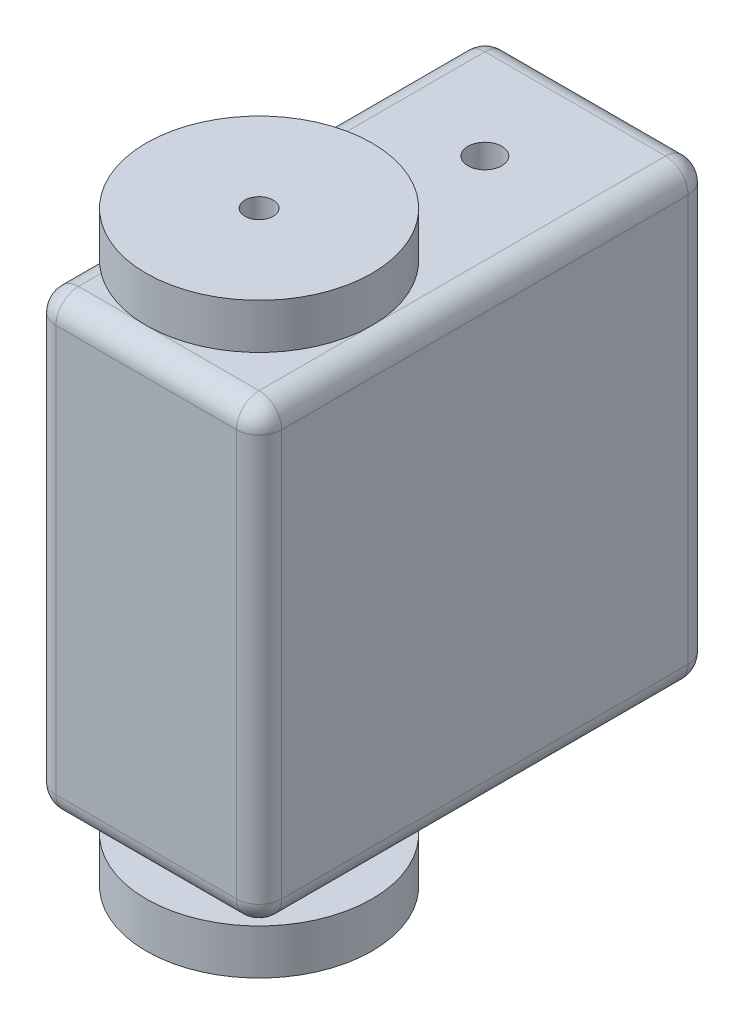
ISO-10303-21;
HEADER;
FILE_DESCRIPTION(('STEP AP214'),'2;1');
FILE_NAME('part.step','',(''),(''),'','','');
FILE_SCHEMA(('AUTOMOTIVE_DESIGN { 1 0 10303 214 1 1 1 1 }'));
ENDSEC;
DATA;
#1=APPLICATION_CONTEXT('core data for automotive mechanical design processes');
#2=APPLICATION_PROTOCOL_DEFINITION('international standard','automotive_design',2000,#1);
#3=PRODUCT_CONTEXT('',#1,'mechanical');
#4=PRODUCT('Part','Part','',(#3));
#5=PRODUCT_RELATED_PRODUCT_CATEGORY('part','',(#4));
#6=PRODUCT_DEFINITION_FORMATION('','',#4);
#7=PRODUCT_DEFINITION_CONTEXT('part definition',#1,'design');
#8=PRODUCT_DEFINITION('design','',#6,#7);
#9=PRODUCT_DEFINITION_SHAPE('','',#8);
#10=(LENGTH_UNIT() NAMED_UNIT(*) SI_UNIT(.MILLI.,.METRE.));
#11=(NAMED_UNIT(*) PLANE_ANGLE_UNIT() SI_UNIT($,.RADIAN.));
#12=(NAMED_UNIT(*) SI_UNIT($,.STERADIAN.) SOLID_ANGLE_UNIT());
#13=UNCERTAINTY_MEASURE_WITH_UNIT(LENGTH_MEASURE(1.E-05),#10,'distance_accuracy_value','');
#14=(GEOMETRIC_REPRESENTATION_CONTEXT(3) GLOBAL_UNCERTAINTY_ASSIGNED_CONTEXT((#13)) GLOBAL_UNIT_ASSIGNED_CONTEXT((#10,
#11,#12)) REPRESENTATION_CONTEXT('',''));
#15=CARTESIAN_POINT('',(0.,0.,0.));
#16=DIRECTION('',(0.,0.,1.));
#17=DIRECTION('',(1.,0.,0.));
#18=AXIS2_PLACEMENT_3D('',#15,#16,#17);
#19=CARTESIAN_POINT('',(10.,-20.,20.));
#20=DIRECTION('',(0.,0.,-1.));
#21=DIRECTION('',(-1.,0.,0.));
#22=AXIS2_PLACEMENT_3D('',#19,#20,#21);
#23=PLANE('',#22);
#24=DIRECTION('',(-1.,0.,0.));
#25=VECTOR('',#24,1.);
#26=CARTESIAN_POINT('',(10.,18.,20.));
#27=LINE('',#26,#25);
#28=CARTESIAN_POINT('',(8.,18.,20.));
#29=VERTEX_POINT('',#28);
#30=CARTESIAN_POINT('',(-8.,18.,20.));
#31=VERTEX_POINT('',#30);
#32=EDGE_CURVE('E138',#29,#31,#27,.T.);
#33=ORIENTED_EDGE('',*,*,#32,.T.);
#34=DIRECTION('',(0.,-1.,0.));
#35=VECTOR('',#34,1.);
#36=CARTESIAN_POINT('',(-8.,-20.,20.));
#37=LINE('',#36,#35);
#38=CARTESIAN_POINT('',(-8.,-18.,20.));
#39=VERTEX_POINT('',#38);
#40=EDGE_CURVE('E133',#31,#39,#37,.T.);
#41=ORIENTED_EDGE('',*,*,#40,.T.);
#42=DIRECTION('',(-1.,0.,0.));
#43=VECTOR('',#42,1.);
#44=CARTESIAN_POINT('',(10.,-18.,20.));
#45=LINE('',#44,#43);
#46=CARTESIAN_POINT('',(8.,-18.,20.));
#47=VERTEX_POINT('',#46);
#48=EDGE_CURVE('E126',#39,#47,#45,.F.);
#49=ORIENTED_EDGE('',*,*,#48,.T.);
#50=DIRECTION('',(0.,-1.,0.));
#51=VECTOR('',#50,1.);
#52=CARTESIAN_POINT('',(8.,20.,20.));
#53=LINE('',#52,#51);
#54=EDGE_CURVE('E130',#47,#29,#53,.F.);
#55=ORIENTED_EDGE('',*,*,#54,.T.);
#56=EDGE_LOOP('',(#33,#41,#49,#55));
#57=FACE_BOUND('',#56,.T.);
#58=ADVANCED_FACE('F38',(#57),#23,.F.);
#59=CARTESIAN_POINT('',(10.,-20.,-20.));
#60=DIRECTION('',(0.,1.,0.));
#61=DIRECTION('',(0.,0.,1.));
#62=AXIS2_PLACEMENT_3D('',#59,#60,#61);
#63=PLANE('',#62);
#64=CARTESIAN_POINT('',(0.,-20.,-9.99999999999999));
#65=DIRECTION('',(0.,1.,0.));
#66=DIRECTION('',(0.,0.,1.));
#67=AXIS2_PLACEMENT_3D('',#64,#65,#66);
#68=CIRCLE('',#67,1.5);
#69=CARTESIAN_POINT('',(0.,-20.,-8.49999999999999));
#70=VERTEX_POINT('',#69);
#71=EDGE_CURVE('E777',#70,#70,#68,.T.);
#72=ORIENTED_EDGE('',*,*,#71,.T.);
#73=EDGE_LOOP('',(#72));
#74=FACE_BOUND('',#73,.T.);
#75=DIRECTION('',(-1.,0.,0.));
#76=VECTOR('',#75,1.);
#77=CARTESIAN_POINT('',(10.,-20.,18.));
#78=LINE('',#77,#76);
#79=CARTESIAN_POINT('',(8.,-20.,18.));
#80=VERTEX_POINT('',#79);
#81=CARTESIAN_POINT('',(-8.,-20.,18.));
#82=VERTEX_POINT('',#81);
#83=EDGE_CURVE('E146',#80,#82,#78,.T.);
#84=ORIENTED_EDGE('',*,*,#83,.T.);
#85=DIRECTION('',(0.,0.,-1.));
#86=VECTOR('',#85,1.);
#87=CARTESIAN_POINT('',(-8.,-20.,-20.));
#88=LINE('',#87,#86);
#89=CARTESIAN_POINT('',(-8.,-20.,-18.));
#90=VERTEX_POINT('',#89);
#91=EDGE_CURVE('E204',#82,#90,#88,.T.);
#92=ORIENTED_EDGE('',*,*,#91,.T.);
#93=DIRECTION('',(-1.,0.,0.));
#94=VECTOR('',#93,1.);
#95=CARTESIAN_POINT('',(10.,-20.,-18.));
#96=LINE('',#95,#94);
#97=CARTESIAN_POINT('',(8.,-20.,-18.));
#98=VERTEX_POINT('',#97);
#99=EDGE_CURVE('E199',#90,#98,#96,.F.);
#100=ORIENTED_EDGE('',*,*,#99,.T.);
#101=DIRECTION('',(0.,0.,-1.));
#102=VECTOR('',#101,1.);
#103=CARTESIAN_POINT('',(8.,-20.,20.));
#104=LINE('',#103,#102);
#105=EDGE_CURVE('E196',#98,#80,#104,.F.);
#106=ORIENTED_EDGE('',*,*,#105,.T.);
#107=EDGE_LOOP('',(#84,#92,#100,#106));
#108=FACE_BOUND('',#107,.T.);
#109=CARTESIAN_POINT('',(0.,-20.,10.));
#110=DIRECTION('',(0.,1.,0.));
#111=DIRECTION('',(0.,0.,1.));
#112=AXIS2_PLACEMENT_3D('',#109,#110,#111);
#113=CIRCLE('',#112,5.);
#114=CARTESIAN_POINT('',(0.,-20.,15.));
#115=VERTEX_POINT('',#114);
#116=EDGE_CURVE('E347',#115,#115,#113,.T.);
#117=ORIENTED_EDGE('',*,*,#116,.T.);
#118=EDGE_LOOP('',(#117));
#119=FACE_BOUND('',#118,.T.);
#120=ADVANCED_FACE('F394',(#74,#108,#119),#63,.F.);
#121=CARTESIAN_POINT('',(10.,-20.,-20.));
#122=DIRECTION('',(0.,0.,1.));
#123=DIRECTION('',(1.,0.,0.));
#124=AXIS2_PLACEMENT_3D('',#121,#122,#123);
#125=PLANE('',#124);
#126=DIRECTION('',(-1.,0.,0.));
#127=VECTOR('',#126,1.);
#128=CARTESIAN_POINT('',(10.,-18.,-20.));
#129=LINE('',#128,#127);
#130=CARTESIAN_POINT('',(8.,-18.,-20.));
#131=VERTEX_POINT('',#130);
#132=CARTESIAN_POINT('',(-8.,-18.,-20.));
#133=VERTEX_POINT('',#132);
#134=EDGE_CURVE('E213',#131,#133,#129,.T.);
#135=ORIENTED_EDGE('',*,*,#134,.T.);
#136=DIRECTION('',(0.,1.,0.));
#137=VECTOR('',#136,1.);
#138=CARTESIAN_POINT('',(-8.,-20.,-20.));
#139=LINE('',#138,#137);
#140=CARTESIAN_POINT('',(-8.,18.,-20.));
#141=VERTEX_POINT('',#140);
#142=EDGE_CURVE('E217',#133,#141,#139,.T.);
#143=ORIENTED_EDGE('',*,*,#142,.T.);
#144=DIRECTION('',(-1.,0.,0.));
#145=VECTOR('',#144,1.);
#146=CARTESIAN_POINT('',(10.,18.,-20.));
#147=LINE('',#146,#145);
#148=CARTESIAN_POINT('',(8.,18.,-20.));
#149=VERTEX_POINT('',#148);
#150=EDGE_CURVE('E210',#141,#149,#147,.F.);
#151=ORIENTED_EDGE('',*,*,#150,.T.);
#152=DIRECTION('',(0.,1.,0.));
#153=VECTOR('',#152,1.);
#154=CARTESIAN_POINT('',(8.,-20.,-20.));
#155=LINE('',#154,#153);
#156=EDGE_CURVE('E207',#149,#131,#155,.F.);
#157=ORIENTED_EDGE('',*,*,#156,.T.);
#158=EDGE_LOOP('',(#135,#143,#151,#157));
#159=FACE_BOUND('',#158,.T.);
#160=ADVANCED_FACE('F401',(#159),#125,.F.);
#161=CARTESIAN_POINT('',(10.,20.,-20.));
#162=DIRECTION('',(0.,-1.,0.));
#163=DIRECTION('',(0.,0.,-1.));
#164=AXIS2_PLACEMENT_3D('',#161,#162,#163);
#165=PLANE('',#164);
#166=CARTESIAN_POINT('',(0.,20.,-9.99999999999999));
#167=DIRECTION('',(0.,1.,0.));
#168=DIRECTION('',(0.,0.,1.));
#169=AXIS2_PLACEMENT_3D('',#166,#167,#168);
#170=CIRCLE('',#169,1.5);
#171=CARTESIAN_POINT('',(0.,20.,-8.49999999999999));
#172=VERTEX_POINT('',#171);
#173=EDGE_CURVE('E334',#172,#172,#170,.T.);
#174=ORIENTED_EDGE('',*,*,#173,.F.);
#175=EDGE_LOOP('',(#174));
#176=FACE_BOUND('',#175,.T.);
#177=CARTESIAN_POINT('',(0.,20.,10.));
#178=DIRECTION('',(0.,-1.,0.));
#179=DIRECTION('',(0.,0.,-1.));
#180=AXIS2_PLACEMENT_3D('',#177,#178,#179);
#181=CIRCLE('',#180,6.73205080756888);
#182=CARTESIAN_POINT('',(0.,20.,3.26794919243112));
#183=VERTEX_POINT('',#182);
#184=EDGE_CURVE('E192',#183,#183,#181,.T.);
#185=ORIENTED_EDGE('',*,*,#184,.T.);
#186=EDGE_LOOP('',(#185));
#187=FACE_BOUND('',#186,.T.);
#188=DIRECTION('',(-1.,0.,0.));
#189=VECTOR('',#188,1.);
#190=CARTESIAN_POINT('',(10.,20.,-18.));
#191=LINE('',#190,#189);
#192=CARTESIAN_POINT('',(8.,20.,-18.));
#193=VERTEX_POINT('',#192);
#194=CARTESIAN_POINT('',(-8.,20.,-18.));
#195=VERTEX_POINT('',#194);
#196=EDGE_CURVE('E182',#193,#195,#191,.T.);
#197=ORIENTED_EDGE('',*,*,#196,.T.);
#198=DIRECTION('',(0.,0.,1.));
#199=VECTOR('',#198,1.);
#200=CARTESIAN_POINT('',(-8.,20.,-20.));
#201=LINE('',#200,#199);
#202=CARTESIAN_POINT('',(-8.,20.,18.));
#203=VERTEX_POINT('',#202);
#204=EDGE_CURVE('E189',#195,#203,#201,.T.);
#205=ORIENTED_EDGE('',*,*,#204,.T.);
#206=DIRECTION('',(-1.,0.,0.));
#207=VECTOR('',#206,1.);
#208=CARTESIAN_POINT('',(10.,20.,18.));
#209=LINE('',#208,#207);
#210=CARTESIAN_POINT('',(8.,20.,18.));
#211=VERTEX_POINT('',#210);
#212=EDGE_CURVE('E185',#203,#211,#209,.F.);
#213=ORIENTED_EDGE('',*,*,#212,.T.);
#214=DIRECTION('',(0.,0.,1.));
#215=VECTOR('',#214,1.);
#216=CARTESIAN_POINT('',(8.,20.,-20.));
#217=LINE('',#216,#215);
#218=EDGE_CURVE('E179',#211,#193,#217,.F.);
#219=ORIENTED_EDGE('',*,*,#218,.T.);
#220=EDGE_LOOP('',(#197,#205,#213,#219));
#221=FACE_BOUND('',#220,.T.);
#222=ADVANCED_FACE('F502',(#176,#187,#221),#165,.F.);
#223=CARTESIAN_POINT('',(10.,0.,0.));
#224=DIRECTION('',(1.,0.,0.));
#225=DIRECTION('',(0.,0.,-1.));
#226=AXIS2_PLACEMENT_3D('',#223,#224,#225);
#227=PLANE('',#226);
#228=DIRECTION('',(0.,0.,-1.));
#229=VECTOR('',#228,1.);
#230=CARTESIAN_POINT('',(10.,-18.,-20.));
#231=LINE('',#230,#229);
#232=CARTESIAN_POINT('',(10.,-18.,18.));
#233=VERTEX_POINT('',#232);
#234=CARTESIAN_POINT('',(10.,-18.,-18.));
#235=VERTEX_POINT('',#234);
#236=EDGE_CURVE('E48',#233,#235,#231,.T.);
#237=ORIENTED_EDGE('',*,*,#236,.T.);
#238=DIRECTION('',(0.,1.,0.));
#239=VECTOR('',#238,1.);
#240=CARTESIAN_POINT('',(10.,20.,-18.));
#241=LINE('',#240,#239);
#242=CARTESIAN_POINT('',(10.,18.,-18.));
#243=VERTEX_POINT('',#242);
#244=EDGE_CURVE('E11',#235,#243,#241,.T.);
#245=ORIENTED_EDGE('',*,*,#244,.T.);
#246=DIRECTION('',(0.,0.,1.));
#247=VECTOR('',#246,1.);
#248=CARTESIAN_POINT('',(10.,18.,20.));
#249=LINE('',#248,#247);
#250=CARTESIAN_POINT('',(10.,18.,18.));
#251=VERTEX_POINT('',#250);
#252=EDGE_CURVE('E233',#243,#251,#249,.T.);
#253=ORIENTED_EDGE('',*,*,#252,.T.);
#254=DIRECTION('',(0.,-1.,0.));
#255=VECTOR('',#254,1.);
#256=CARTESIAN_POINT('',(10.,-20.,18.));
#257=LINE('',#256,#255);
#258=EDGE_CURVE('E59',#251,#233,#257,.T.);
#259=ORIENTED_EDGE('',*,*,#258,.T.);
#260=EDGE_LOOP('',(#237,#245,#253,#259));
#261=FACE_BOUND('',#260,.T.);
#262=ADVANCED_FACE('F499',(#261),#227,.T.);
#263=CARTESIAN_POINT('',(-10.,0.,0.));
#264=DIRECTION('',(1.,0.,0.));
#265=DIRECTION('',(0.,0.,-1.));
#266=AXIS2_PLACEMENT_3D('',#263,#264,#265);
#267=PLANE('',#266);
#268=DIRECTION('',(0.,0.,-1.));
#269=VECTOR('',#268,1.);
#270=CARTESIAN_POINT('',(-10.,-18.,0.));
#271=LINE('',#270,#269);
#272=CARTESIAN_POINT('',(-10.,-18.,-18.));
#273=VERTEX_POINT('',#272);
#274=CARTESIAN_POINT('',(-10.,-18.,18.));
#275=VERTEX_POINT('',#274);
#276=EDGE_CURVE('E226',#273,#275,#271,.F.);
#277=ORIENTED_EDGE('',*,*,#276,.T.);
#278=DIRECTION('',(0.,-1.,0.));
#279=VECTOR('',#278,1.);
#280=CARTESIAN_POINT('',(-10.,0.,18.));
#281=LINE('',#280,#279);
#282=CARTESIAN_POINT('',(-10.,18.,18.));
#283=VERTEX_POINT('',#282);
#284=EDGE_CURVE('E230',#275,#283,#281,.F.);
#285=ORIENTED_EDGE('',*,*,#284,.T.);
#286=DIRECTION('',(0.,0.,1.));
#287=VECTOR('',#286,1.);
#288=CARTESIAN_POINT('',(-10.,18.,0.));
#289=LINE('',#288,#287);
#290=CARTESIAN_POINT('',(-10.,18.,-18.));
#291=VERTEX_POINT('',#290);
#292=EDGE_CURVE('E223',#283,#291,#289,.F.);
#293=ORIENTED_EDGE('',*,*,#292,.T.);
#294=DIRECTION('',(0.,1.,0.));
#295=VECTOR('',#294,1.);
#296=CARTESIAN_POINT('',(-10.,0.,-18.));
#297=LINE('',#296,#295);
#298=EDGE_CURVE('E220',#291,#273,#297,.F.);
#299=ORIENTED_EDGE('',*,*,#298,.T.);
#300=EDGE_LOOP('',(#277,#285,#293,#299));
#301=FACE_BOUND('',#300,.T.);
#302=ADVANCED_FACE('F501',(#301),#267,.F.);
#303=CARTESIAN_POINT('',(0.,21.,10.));
#304=DIRECTION('',(0.,1.,0.));
#305=DIRECTION('',(0.,0.,1.));
#306=AXIS2_PLACEMENT_3D('',#303,#304,#305);
#307=PLANE('',#306);
#308=CARTESIAN_POINT('',(0.,21.,10.));
#309=DIRECTION('',(0.,1.,0.));
#310=DIRECTION('',(0.,0.,1.));
#311=AXIS2_PLACEMENT_3D('',#308,#309,#310);
#312=CIRCLE('',#311,2.5);
#313=CARTESIAN_POINT('',(0.,21.,12.5));
#314=VERTEX_POINT('',#313);
#315=EDGE_CURVE('E167',#314,#314,#312,.T.);
#316=ORIENTED_EDGE('',*,*,#315,.F.);
#317=EDGE_LOOP('',(#316));
#318=FACE_BOUND('',#317,.T.);
#319=CARTESIAN_POINT('',(0.,21.,10.));
#320=DIRECTION('',(0.,1.,0.));
#321=DIRECTION('',(0.,0.,1.));
#322=AXIS2_PLACEMENT_3D('',#319,#320,#321);
#323=CIRCLE('',#322,5.);
#324=CARTESIAN_POINT('',(0.,21.,15.));
#325=VERTEX_POINT('',#324);
#326=EDGE_CURVE('E171',#325,#325,#323,.T.);
#327=ORIENTED_EDGE('',*,*,#326,.T.);
#328=EDGE_LOOP('',(#327));
#329=FACE_BOUND('',#328,.T.);
#330=ADVANCED_FACE('F376',(#318,#329),#307,.T.);
#331=CARTESIAN_POINT('',(0.,22.,10.));
#332=DIRECTION('',(0.,-1.,0.));
#333=DIRECTION('',(0.,0.,-1.));
#334=AXIS2_PLACEMENT_3D('',#331,#332,#333);
#335=CYLINDRICAL_SURFACE('',#334,2.5);
#336=CARTESIAN_POINT('',(0.,22.,10.));
#337=DIRECTION('',(0.,1.,0.));
#338=DIRECTION('',(0.,0.,1.));
#339=AXIS2_PLACEMENT_3D('',#336,#337,#338);
#340=CIRCLE('',#339,2.5);
#341=CARTESIAN_POINT('',(0.,22.,12.5));
#342=VERTEX_POINT('',#341);
#343=EDGE_CURVE('E364',#342,#342,#340,.T.);
#344=ORIENTED_EDGE('',*,*,#343,.F.);
#345=EDGE_LOOP('',(#344));
#346=FACE_BOUND('',#345,.T.);
#347=ORIENTED_EDGE('',*,*,#315,.T.);
#348=EDGE_LOOP('',(#347));
#349=FACE_BOUND('',#348,.T.);
#350=ADVANCED_FACE('F545',(#346,#349),#335,.T.);
#351=CARTESIAN_POINT('',(0.,26.,10.));
#352=DIRECTION('',(0.,-1.,0.));
#353=DIRECTION('',(0.,0.,-1.));
#354=AXIS2_PLACEMENT_3D('',#351,#352,#353);
#355=CYLINDRICAL_SURFACE('',#354,10.);
#356=CARTESIAN_POINT('',(0.,26.,10.));
#357=DIRECTION('',(0.,1.,0.));
#358=DIRECTION('',(0.,0.,1.));
#359=AXIS2_PLACEMENT_3D('',#356,#357,#358);
#360=CIRCLE('',#359,10.);
#361=CARTESIAN_POINT('',(0.,26.,20.));
#362=VERTEX_POINT('',#361);
#363=EDGE_CURVE('E360',#362,#362,#360,.T.);
#364=ORIENTED_EDGE('',*,*,#363,.F.);
#365=EDGE_LOOP('',(#364));
#366=FACE_BOUND('',#365,.T.);
#367=CARTESIAN_POINT('',(0.,22.,10.));
#368=DIRECTION('',(0.,1.,0.));
#369=DIRECTION('',(0.,0.,1.));
#370=AXIS2_PLACEMENT_3D('',#367,#368,#369);
#371=CIRCLE('',#370,10.);
#372=CARTESIAN_POINT('',(0.,22.,20.));
#373=VERTEX_POINT('',#372);
#374=EDGE_CURVE('E359',#373,#373,#371,.T.);
#375=ORIENTED_EDGE('',*,*,#374,.T.);
#376=EDGE_LOOP('',(#375));
#377=FACE_BOUND('',#376,.T.);
#378=ADVANCED_FACE('F551',(#366,#377),#355,.T.);
#379=CARTESIAN_POINT('',(0.,26.,10.));
#380=DIRECTION('',(0.,1.,0.));
#381=DIRECTION('',(0.,0.,1.));
#382=AXIS2_PLACEMENT_3D('',#379,#380,#381);
#383=PLANE('',#382);
#384=CARTESIAN_POINT('',(0.,26.,10.));
#385=DIRECTION('',(0.,1.,0.));
#386=DIRECTION('',(0.,0.,1.));
#387=AXIS2_PLACEMENT_3D('',#384,#385,#386);
#388=CIRCLE('',#387,1.25);
#389=CARTESIAN_POINT('',(0.,26.,11.25));
#390=VERTEX_POINT('',#389);
#391=EDGE_CURVE('E352',#390,#390,#388,.T.);
#392=ORIENTED_EDGE('',*,*,#391,.F.);
#393=EDGE_LOOP('',(#392));
#394=FACE_BOUND('',#393,.T.);
#395=ORIENTED_EDGE('',*,*,#363,.T.);
#396=EDGE_LOOP('',(#395));
#397=FACE_BOUND('',#396,.T.);
#398=ADVANCED_FACE('F558',(#394,#397),#383,.T.);
#399=CARTESIAN_POINT('',(0.,22.,10.));
#400=DIRECTION('',(0.,1.,0.));
#401=DIRECTION('',(0.,0.,1.));
#402=AXIS2_PLACEMENT_3D('',#399,#400,#401);
#403=PLANE('',#402);
#404=ORIENTED_EDGE('',*,*,#343,.T.);
#405=EDGE_LOOP('',(#404));
#406=FACE_BOUND('',#405,.T.);
#407=ORIENTED_EDGE('',*,*,#374,.F.);
#408=EDGE_LOOP('',(#407));
#409=FACE_BOUND('',#408,.T.);
#410=ADVANCED_FACE('F568',(#406,#409),#403,.F.);
#411=CARTESIAN_POINT('',(0.,16.4644660940673,10.));
#412=DIRECTION('',(0.,1.,0.));
#413=DIRECTION('',(0.,0.,1.));
#414=AXIS2_PLACEMENT_3D('',#411,#412,#413);
#415=CYLINDRICAL_SURFACE('',#414,1.25);
#416=ORIENTED_EDGE('',*,*,#391,.T.);
#417=EDGE_LOOP('',(#416));
#418=FACE_BOUND('',#417,.T.);
#419=CARTESIAN_POINT('',(0.,-26.,10.));
#420=DIRECTION('',(0.,1.,0.));
#421=DIRECTION('',(0.,0.,1.));
#422=AXIS2_PLACEMENT_3D('',#419,#420,#421);
#423=CIRCLE('',#422,1.25);
#424=CARTESIAN_POINT('',(0.,-26.,11.25));
#425=VERTEX_POINT('',#424);
#426=EDGE_CURVE('E317',#425,#425,#423,.T.);
#427=ORIENTED_EDGE('',*,*,#426,.F.);
#428=EDGE_LOOP('',(#427));
#429=FACE_BOUND('',#428,.T.);
#430=ADVANCED_FACE('F578',(#418,#429),#415,.F.);
#431=CARTESIAN_POINT('',(0.,-21.,10.));
#432=DIRECTION('',(0.,1.,0.));
#433=DIRECTION('',(0.,0.,1.));
#434=AXIS2_PLACEMENT_3D('',#431,#432,#433);
#435=CYLINDRICAL_SURFACE('',#434,5.);
#436=CARTESIAN_POINT('',(0.,-21.,10.));
#437=DIRECTION('',(0.,1.,0.));
#438=DIRECTION('',(0.,0.,1.));
#439=AXIS2_PLACEMENT_3D('',#436,#437,#438);
#440=CIRCLE('',#439,5.);
#441=CARTESIAN_POINT('',(0.,-21.,15.));
#442=VERTEX_POINT('',#441);
#443=EDGE_CURVE('E348',#442,#442,#440,.T.);
#444=ORIENTED_EDGE('',*,*,#443,.T.);
#445=EDGE_LOOP('',(#444));
#446=FACE_BOUND('',#445,.T.);
#447=ORIENTED_EDGE('',*,*,#116,.F.);
#448=EDGE_LOOP('',(#447));
#449=FACE_BOUND('',#448,.T.);
#450=ADVANCED_FACE('F583',(#446,#449),#435,.T.);
#451=CARTESIAN_POINT('',(0.,-21.,10.));
#452=DIRECTION('',(0.,-1.,0.));
#453=DIRECTION('',(0.,0.,1.));
#454=AXIS2_PLACEMENT_3D('',#451,#452,#453);
#455=PLANE('',#454);
#456=CARTESIAN_POINT('',(0.,-21.,10.));
#457=DIRECTION('',(0.,1.,0.));
#458=DIRECTION('',(0.,0.,1.));
#459=AXIS2_PLACEMENT_3D('',#456,#457,#458);
#460=CIRCLE('',#459,2.5);
#461=CARTESIAN_POINT('',(0.,-21.,12.5));
#462=VERTEX_POINT('',#461);
#463=EDGE_CURVE('E343',#462,#462,#460,.T.);
#464=ORIENTED_EDGE('',*,*,#463,.T.);
#465=EDGE_LOOP('',(#464));
#466=FACE_BOUND('',#465,.T.);
#467=ORIENTED_EDGE('',*,*,#443,.F.);
#468=EDGE_LOOP('',(#467));
#469=FACE_BOUND('',#468,.T.);
#470=ADVANCED_FACE('F591',(#466,#469),#455,.T.);
#471=CARTESIAN_POINT('',(0.,-22.,10.));
#472=DIRECTION('',(0.,1.,0.));
#473=DIRECTION('',(0.,0.,1.));
#474=AXIS2_PLACEMENT_3D('',#471,#472,#473);
#475=CYLINDRICAL_SURFACE('',#474,2.5);
#476=CARTESIAN_POINT('',(0.,-22.,10.));
#477=DIRECTION('',(0.,1.,0.));
#478=DIRECTION('',(0.,0.,1.));
#479=AXIS2_PLACEMENT_3D('',#476,#477,#478);
#480=CIRCLE('',#479,2.5);
#481=CARTESIAN_POINT('',(0.,-22.,12.5));
#482=VERTEX_POINT('',#481);
#483=EDGE_CURVE('E338',#482,#482,#480,.T.);
#484=ORIENTED_EDGE('',*,*,#483,.T.);
#485=EDGE_LOOP('',(#484));
#486=FACE_BOUND('',#485,.T.);
#487=ORIENTED_EDGE('',*,*,#463,.F.);
#488=EDGE_LOOP('',(#487));
#489=FACE_BOUND('',#488,.T.);
#490=ADVANCED_FACE('F599',(#486,#489),#475,.T.);
#491=CARTESIAN_POINT('',(0.,-26.,10.));
#492=DIRECTION('',(0.,1.,0.));
#493=DIRECTION('',(0.,0.,1.));
#494=AXIS2_PLACEMENT_3D('',#491,#492,#493);
#495=CYLINDRICAL_SURFACE('',#494,10.);
#496=CARTESIAN_POINT('',(0.,-26.,10.));
#497=DIRECTION('',(0.,1.,0.));
#498=DIRECTION('',(0.,0.,1.));
#499=AXIS2_PLACEMENT_3D('',#496,#497,#498);
#500=CIRCLE('',#499,10.);
#501=CARTESIAN_POINT('',(0.,-26.,20.));
#502=VERTEX_POINT('',#501);
#503=EDGE_CURVE('E330',#502,#502,#500,.T.);
#504=ORIENTED_EDGE('',*,*,#503,.T.);
#505=EDGE_LOOP('',(#504));
#506=FACE_BOUND('',#505,.T.);
#507=CARTESIAN_POINT('',(0.,-22.,10.));
#508=DIRECTION('',(0.,1.,0.));
#509=DIRECTION('',(0.,0.,1.));
#510=AXIS2_PLACEMENT_3D('',#507,#508,#509);
#511=CIRCLE('',#510,10.);
#512=CARTESIAN_POINT('',(0.,-22.,20.));
#513=VERTEX_POINT('',#512);
#514=EDGE_CURVE('E324',#513,#513,#511,.T.);
#515=ORIENTED_EDGE('',*,*,#514,.F.);
#516=EDGE_LOOP('',(#515));
#517=FACE_BOUND('',#516,.T.);
#518=ADVANCED_FACE('F607',(#506,#517),#495,.T.);
#519=CARTESIAN_POINT('',(0.,-26.,10.));
#520=DIRECTION('',(0.,-1.,0.));
#521=DIRECTION('',(0.,0.,1.));
#522=AXIS2_PLACEMENT_3D('',#519,#520,#521);
#523=PLANE('',#522);
#524=ORIENTED_EDGE('',*,*,#426,.T.);
#525=EDGE_LOOP('',(#524));
#526=FACE_BOUND('',#525,.T.);
#527=ORIENTED_EDGE('',*,*,#503,.F.);
#528=EDGE_LOOP('',(#527));
#529=FACE_BOUND('',#528,.T.);
#530=ADVANCED_FACE('F475',(#526,#529),#523,.T.);
#531=CARTESIAN_POINT('',(0.,-22.,10.));
#532=DIRECTION('',(0.,-1.,0.));
#533=DIRECTION('',(0.,0.,1.));
#534=AXIS2_PLACEMENT_3D('',#531,#532,#533);
#535=PLANE('',#534);
#536=ORIENTED_EDGE('',*,*,#483,.F.);
#537=EDGE_LOOP('',(#536));
#538=FACE_BOUND('',#537,.T.);
#539=ORIENTED_EDGE('',*,*,#514,.T.);
#540=EDGE_LOOP('',(#539));
#541=FACE_BOUND('',#540,.T.);
#542=ADVANCED_FACE('F470',(#538,#541),#535,.F.);
#543=CARTESIAN_POINT('',(10.,-18.,-18.));
#544=DIRECTION('',(-1.,0.,0.));
#545=DIRECTION('',(0.,0.,1.));
#546=AXIS2_PLACEMENT_3D('',#543,#544,#545);
#547=CYLINDRICAL_SURFACE('',#546,2.);
#548=CARTESIAN_POINT('',(8.,-18.,-18.));
#549=DIRECTION('',(1.,0.,0.));
#550=DIRECTION('',(0.,0.,-1.));
#551=AXIS2_PLACEMENT_3D('',#548,#549,#550);
#552=CIRCLE('',#551,2.);
#553=EDGE_CURVE('E42',#98,#131,#552,.T.);
#554=ORIENTED_EDGE('',*,*,#553,.F.);
#555=ORIENTED_EDGE('',*,*,#99,.F.);
#556=CARTESIAN_POINT('',(-8.,-18.,-18.));
#557=DIRECTION('',(-1.,0.,0.));
#558=DIRECTION('',(0.,0.,1.));
#559=AXIS2_PLACEMENT_3D('',#556,#557,#558);
#560=CIRCLE('',#559,2.);
#561=EDGE_CURVE('E308',#133,#90,#560,.T.);
#562=ORIENTED_EDGE('',*,*,#561,.F.);
#563=ORIENTED_EDGE('',*,*,#134,.F.);
#564=EDGE_LOOP('',(#554,#555,#562,#563));
#565=FACE_BOUND('',#564,.T.);
#566=ADVANCED_FACE('F468',(#565),#547,.T.);
#567=CARTESIAN_POINT('',(8.,-18.,-18.));
#568=DIRECTION('',(0.,0.,1.));
#569=DIRECTION('',(1.,0.,0.));
#570=AXIS2_PLACEMENT_3D('',#567,#568,#569);
#571=SPHERICAL_SURFACE('',#570,2.);
#572=CARTESIAN_POINT('',(8.,-18.,-18.));
#573=DIRECTION('',(0.,0.,-1.));
#574=DIRECTION('',(-1.,0.,0.));
#575=AXIS2_PLACEMENT_3D('',#572,#573,#574);
#576=CIRCLE('',#575,2.);
#577=EDGE_CURVE('E302',#98,#235,#576,.F.);
#578=ORIENTED_EDGE('',*,*,#577,.F.);
#579=ORIENTED_EDGE('',*,*,#553,.T.);
#580=CARTESIAN_POINT('',(8.,-18.,-18.));
#581=DIRECTION('',(0.,-1.,0.));
#582=DIRECTION('',(0.,0.,-1.));
#583=AXIS2_PLACEMENT_3D('',#580,#581,#582);
#584=CIRCLE('',#583,2.);
#585=EDGE_CURVE('E305',#235,#131,#584,.F.);
#586=ORIENTED_EDGE('',*,*,#585,.F.);
#587=EDGE_LOOP('',(#578,#579,#586));
#588=FACE_BOUND('',#587,.T.);
#589=ADVANCED_FACE('F466',(#588),#571,.T.);
#590=CARTESIAN_POINT('',(-8.,-18.,-18.));
#591=DIRECTION('',(0.,0.,1.));
#592=DIRECTION('',(1.,0.,0.));
#593=AXIS2_PLACEMENT_3D('',#590,#591,#592);
#594=SPHERICAL_SURFACE('',#593,2.);
#595=CARTESIAN_POINT('',(-8.,-18.,-18.));
#596=DIRECTION('',(0.,-1.,0.));
#597=DIRECTION('',(0.,0.,-1.));
#598=AXIS2_PLACEMENT_3D('',#595,#596,#597);
#599=CIRCLE('',#598,2.);
#600=EDGE_CURVE('E294',#133,#273,#599,.F.);
#601=ORIENTED_EDGE('',*,*,#600,.F.);
#602=ORIENTED_EDGE('',*,*,#561,.T.);
#603=CARTESIAN_POINT('',(-8.,-18.,-18.));
#604=DIRECTION('',(0.,0.,-1.));
#605=DIRECTION('',(-1.,0.,0.));
#606=AXIS2_PLACEMENT_3D('',#603,#604,#605);
#607=CIRCLE('',#606,2.);
#608=EDGE_CURVE('E298',#273,#90,#607,.F.);
#609=ORIENTED_EDGE('',*,*,#608,.F.);
#610=EDGE_LOOP('',(#601,#602,#609));
#611=FACE_BOUND('',#610,.T.);
#612=ADVANCED_FACE('F462',(#611),#594,.T.);
#613=CARTESIAN_POINT('',(8.,0.,-18.));
#614=DIRECTION('',(0.,-1.,0.));
#615=DIRECTION('',(0.,0.,-1.));
#616=AXIS2_PLACEMENT_3D('',#613,#614,#615);
#617=CYLINDRICAL_SURFACE('',#616,2.);
#618=ORIENTED_EDGE('',*,*,#585,.T.);
#619=ORIENTED_EDGE('',*,*,#156,.F.);
#620=CARTESIAN_POINT('',(8.,18.,-18.));
#621=DIRECTION('',(0.,1.,0.));
#622=DIRECTION('',(0.,0.,1.));
#623=AXIS2_PLACEMENT_3D('',#620,#621,#622);
#624=CIRCLE('',#623,2.);
#625=EDGE_CURVE('E286',#243,#149,#624,.T.);
#626=ORIENTED_EDGE('',*,*,#625,.F.);
#627=ORIENTED_EDGE('',*,*,#244,.F.);
#628=EDGE_LOOP('',(#618,#619,#626,#627));
#629=FACE_BOUND('',#628,.T.);
#630=ADVANCED_FACE('F458',(#629),#617,.T.);
#631=CARTESIAN_POINT('',(8.,-18.,0.));
#632=DIRECTION('',(0.,0.,1.));
#633=DIRECTION('',(0.,-1.,0.));
#634=AXIS2_PLACEMENT_3D('',#631,#632,#633);
#635=CYLINDRICAL_SURFACE('',#634,2.);
#636=ORIENTED_EDGE('',*,*,#577,.T.);
#637=ORIENTED_EDGE('',*,*,#236,.F.);
#638=CARTESIAN_POINT('',(8.,-18.,18.));
#639=DIRECTION('',(0.,0.,1.));
#640=DIRECTION('',(1.,0.,0.));
#641=AXIS2_PLACEMENT_3D('',#638,#639,#640);
#642=CIRCLE('',#641,2.);
#643=EDGE_CURVE('E151',#80,#233,#642,.T.);
#644=ORIENTED_EDGE('',*,*,#643,.F.);
#645=ORIENTED_EDGE('',*,*,#105,.F.);
#646=EDGE_LOOP('',(#636,#637,#644,#645));
#647=FACE_BOUND('',#646,.T.);
#648=ADVANCED_FACE('F455',(#647),#635,.T.);
#649=CARTESIAN_POINT('',(10.,-18.,18.));
#650=DIRECTION('',(-1.,0.,0.));
#651=DIRECTION('',(0.,0.,1.));
#652=AXIS2_PLACEMENT_3D('',#649,#650,#651);
#653=CYLINDRICAL_SURFACE('',#652,2.);
#654=CARTESIAN_POINT('',(-8.,-18.,18.));
#655=DIRECTION('',(-1.,0.,0.));
#656=DIRECTION('',(0.,0.,1.));
#657=AXIS2_PLACEMENT_3D('',#654,#655,#656);
#658=CIRCLE('',#657,2.);
#659=EDGE_CURVE('E152',#82,#39,#658,.T.);
#660=ORIENTED_EDGE('',*,*,#659,.F.);
#661=ORIENTED_EDGE('',*,*,#83,.F.);
#662=CARTESIAN_POINT('',(8.,-18.,18.));
#663=DIRECTION('',(1.,0.,0.));
#664=DIRECTION('',(0.,0.,-1.));
#665=AXIS2_PLACEMENT_3D('',#662,#663,#664);
#666=CIRCLE('',#665,2.);
#667=EDGE_CURVE('E142',#47,#80,#666,.T.);
#668=ORIENTED_EDGE('',*,*,#667,.F.);
#669=ORIENTED_EDGE('',*,*,#48,.F.);
#670=EDGE_LOOP('',(#660,#661,#668,#669));
#671=FACE_BOUND('',#670,.T.);
#672=ADVANCED_FACE('F144',(#671),#653,.T.);
#673=CARTESIAN_POINT('',(-8.,-18.,-20.));
#674=DIRECTION('',(0.,0.,-1.));
#675=DIRECTION('',(0.,1.,0.));
#676=AXIS2_PLACEMENT_3D('',#673,#674,#675);
#677=CYLINDRICAL_SURFACE('',#676,2.);
#678=ORIENTED_EDGE('',*,*,#608,.T.);
#679=ORIENTED_EDGE('',*,*,#91,.F.);
#680=CARTESIAN_POINT('',(-8.,-18.,18.));
#681=DIRECTION('',(0.,0.,1.));
#682=DIRECTION('',(1.,0.,0.));
#683=AXIS2_PLACEMENT_3D('',#680,#681,#682);
#684=CIRCLE('',#683,2.);
#685=EDGE_CURVE('E279',#275,#82,#684,.T.);
#686=ORIENTED_EDGE('',*,*,#685,.F.);
#687=ORIENTED_EDGE('',*,*,#276,.F.);
#688=EDGE_LOOP('',(#678,#679,#686,#687));
#689=FACE_BOUND('',#688,.T.);
#690=ADVANCED_FACE('F448',(#689),#677,.T.);
#691=CARTESIAN_POINT('',(-8.,-20.,-18.));
#692=DIRECTION('',(0.,1.,0.));
#693=DIRECTION('',(0.,0.,1.));
#694=AXIS2_PLACEMENT_3D('',#691,#692,#693);
#695=CYLINDRICAL_SURFACE('',#694,2.);
#696=ORIENTED_EDGE('',*,*,#600,.T.);
#697=ORIENTED_EDGE('',*,*,#298,.F.);
#698=CARTESIAN_POINT('',(-8.,18.,-18.));
#699=DIRECTION('',(0.,1.,0.));
#700=DIRECTION('',(0.,0.,1.));
#701=AXIS2_PLACEMENT_3D('',#698,#699,#700);
#702=CIRCLE('',#701,2.);
#703=EDGE_CURVE('E275',#141,#291,#702,.T.);
#704=ORIENTED_EDGE('',*,*,#703,.F.);
#705=ORIENTED_EDGE('',*,*,#142,.F.);
#706=EDGE_LOOP('',(#696,#697,#704,#705));
#707=FACE_BOUND('',#706,.T.);
#708=ADVANCED_FACE('F444',(#707),#695,.T.);
#709=CARTESIAN_POINT('',(10.,18.,-18.));
#710=DIRECTION('',(-1.,0.,0.));
#711=DIRECTION('',(0.,0.,1.));
#712=AXIS2_PLACEMENT_3D('',#709,#710,#711);
#713=CYLINDRICAL_SURFACE('',#712,2.);
#714=CARTESIAN_POINT('',(8.,18.,-18.));
#715=DIRECTION('',(1.,0.,0.));
#716=DIRECTION('',(0.,0.,-1.));
#717=AXIS2_PLACEMENT_3D('',#714,#715,#716);
#718=CIRCLE('',#717,2.);
#719=EDGE_CURVE('E290',#149,#193,#718,.T.);
#720=ORIENTED_EDGE('',*,*,#719,.F.);
#721=ORIENTED_EDGE('',*,*,#150,.F.);
#722=CARTESIAN_POINT('',(-8.,18.,-18.));
#723=DIRECTION('',(-1.,0.,0.));
#724=DIRECTION('',(0.,0.,1.));
#725=AXIS2_PLACEMENT_3D('',#722,#723,#724);
#726=CIRCLE('',#725,2.);
#727=EDGE_CURVE('E271',#195,#141,#726,.T.);
#728=ORIENTED_EDGE('',*,*,#727,.F.);
#729=ORIENTED_EDGE('',*,*,#196,.F.);
#730=EDGE_LOOP('',(#720,#721,#728,#729));
#731=FACE_BOUND('',#730,.T.);
#732=ADVANCED_FACE('F440',(#731),#713,.T.);
#733=CARTESIAN_POINT('',(8.,18.,-18.));
#734=DIRECTION('',(0.,0.,1.));
#735=DIRECTION('',(1.,0.,0.));
#736=AXIS2_PLACEMENT_3D('',#733,#734,#735);
#737=SPHERICAL_SURFACE('',#736,2.);
#738=ORIENTED_EDGE('',*,*,#625,.T.);
#739=ORIENTED_EDGE('',*,*,#719,.T.);
#740=CARTESIAN_POINT('',(8.,18.,-18.));
#741=DIRECTION('',(0.,0.,-1.));
#742=DIRECTION('',(-1.,0.,0.));
#743=AXIS2_PLACEMENT_3D('',#740,#741,#742);
#744=CIRCLE('',#743,2.);
#745=EDGE_CURVE('E159',#243,#193,#744,.F.);
#746=ORIENTED_EDGE('',*,*,#745,.F.);
#747=EDGE_LOOP('',(#738,#739,#746));
#748=FACE_BOUND('',#747,.T.);
#749=ADVANCED_FACE('F437',(#748),#737,.T.);
#750=CARTESIAN_POINT('',(8.,-18.,18.));
#751=DIRECTION('',(0.,0.,1.));
#752=DIRECTION('',(1.,0.,0.));
#753=AXIS2_PLACEMENT_3D('',#750,#751,#752);
#754=SPHERICAL_SURFACE('',#753,2.);
#755=ORIENTED_EDGE('',*,*,#667,.T.);
#756=ORIENTED_EDGE('',*,*,#643,.T.);
#757=CARTESIAN_POINT('',(8.,-18.,18.));
#758=DIRECTION('',(0.,-1.,0.));
#759=DIRECTION('',(0.,0.,-1.));
#760=AXIS2_PLACEMENT_3D('',#757,#758,#759);
#761=CIRCLE('',#760,2.);
#762=EDGE_CURVE('E155',#47,#233,#761,.F.);
#763=ORIENTED_EDGE('',*,*,#762,.F.);
#764=EDGE_LOOP('',(#755,#756,#763));
#765=FACE_BOUND('',#764,.T.);
#766=ADVANCED_FACE('F156',(#765),#754,.T.);
#767=CARTESIAN_POINT('',(-8.,-18.,18.));
#768=DIRECTION('',(0.,0.,1.));
#769=DIRECTION('',(1.,0.,0.));
#770=AXIS2_PLACEMENT_3D('',#767,#768,#769);
#771=SPHERICAL_SURFACE('',#770,2.);
#772=ORIENTED_EDGE('',*,*,#685,.T.);
#773=ORIENTED_EDGE('',*,*,#659,.T.);
#774=CARTESIAN_POINT('',(-8.,-18.,18.));
#775=DIRECTION('',(0.,-1.,0.));
#776=DIRECTION('',(0.,0.,-1.));
#777=AXIS2_PLACEMENT_3D('',#774,#775,#776);
#778=CIRCLE('',#777,2.);
#779=EDGE_CURVE('E160',#275,#39,#778,.F.);
#780=ORIENTED_EDGE('',*,*,#779,.F.);
#781=EDGE_LOOP('',(#772,#773,#780));
#782=FACE_BOUND('',#781,.T.);
#783=ADVANCED_FACE('F430',(#782),#771,.T.);
#784=CARTESIAN_POINT('',(-8.,18.,-18.));
#785=DIRECTION('',(0.,0.,1.));
#786=DIRECTION('',(1.,0.,0.));
#787=AXIS2_PLACEMENT_3D('',#784,#785,#786);
#788=SPHERICAL_SURFACE('',#787,2.);
#789=ORIENTED_EDGE('',*,*,#727,.T.);
#790=ORIENTED_EDGE('',*,*,#703,.T.);
#791=CARTESIAN_POINT('',(-8.,18.,-18.));
#792=DIRECTION('',(0.,0.,-1.));
#793=DIRECTION('',(-1.,0.,0.));
#794=AXIS2_PLACEMENT_3D('',#791,#792,#793);
#795=CIRCLE('',#794,2.);
#796=EDGE_CURVE('E261',#195,#291,#795,.F.);
#797=ORIENTED_EDGE('',*,*,#796,.F.);
#798=EDGE_LOOP('',(#789,#790,#797));
#799=FACE_BOUND('',#798,.T.);
#800=ADVANCED_FACE('F426',(#799),#788,.T.);
#801=CARTESIAN_POINT('',(8.,18.,0.));
#802=DIRECTION('',(0.,0.,-1.));
#803=DIRECTION('',(0.,1.,0.));
#804=AXIS2_PLACEMENT_3D('',#801,#802,#803);
#805=CYLINDRICAL_SURFACE('',#804,2.);
#806=ORIENTED_EDGE('',*,*,#745,.T.);
#807=ORIENTED_EDGE('',*,*,#218,.F.);
#808=CARTESIAN_POINT('',(8.,18.,18.));
#809=DIRECTION('',(0.,0.,1.));
#810=DIRECTION('',(1.,0.,0.));
#811=AXIS2_PLACEMENT_3D('',#808,#809,#810);
#812=CIRCLE('',#811,2.);
#813=EDGE_CURVE('E257',#251,#211,#812,.T.);
#814=ORIENTED_EDGE('',*,*,#813,.F.);
#815=ORIENTED_EDGE('',*,*,#252,.F.);
#816=EDGE_LOOP('',(#806,#807,#814,#815));
#817=FACE_BOUND('',#816,.T.);
#818=ADVANCED_FACE('F423',(#817),#805,.T.);
#819=CARTESIAN_POINT('',(8.,0.,18.));
#820=DIRECTION('',(0.,1.,0.));
#821=DIRECTION('',(0.,0.,1.));
#822=AXIS2_PLACEMENT_3D('',#819,#820,#821);
#823=CYLINDRICAL_SURFACE('',#822,2.);
#824=ORIENTED_EDGE('',*,*,#762,.T.);
#825=ORIENTED_EDGE('',*,*,#258,.F.);
#826=CARTESIAN_POINT('',(8.,18.,18.));
#827=DIRECTION('',(0.,1.,0.));
#828=DIRECTION('',(-1.,0.,0.));
#829=AXIS2_PLACEMENT_3D('',#826,#827,#828);
#830=CIRCLE('',#829,2.);
#831=EDGE_CURVE('E164',#29,#251,#830,.T.);
#832=ORIENTED_EDGE('',*,*,#831,.F.);
#833=ORIENTED_EDGE('',*,*,#54,.F.);
#834=EDGE_LOOP('',(#824,#825,#832,#833));
#835=FACE_BOUND('',#834,.T.);
#836=ADVANCED_FACE('F162',(#835),#823,.T.);
#837=CARTESIAN_POINT('',(-8.,-20.,18.));
#838=DIRECTION('',(0.,-1.,0.));
#839=DIRECTION('',(0.,0.,-1.));
#840=AXIS2_PLACEMENT_3D('',#837,#838,#839);
#841=CYLINDRICAL_SURFACE('',#840,2.);
#842=ORIENTED_EDGE('',*,*,#779,.T.);
#843=ORIENTED_EDGE('',*,*,#40,.F.);
#844=CARTESIAN_POINT('',(-8.,18.,18.));
#845=DIRECTION('',(0.,1.,0.));
#846=DIRECTION('',(0.,0.,1.));
#847=AXIS2_PLACEMENT_3D('',#844,#845,#846);
#848=CIRCLE('',#847,2.);
#849=EDGE_CURVE('E251',#283,#31,#848,.T.);
#850=ORIENTED_EDGE('',*,*,#849,.F.);
#851=ORIENTED_EDGE('',*,*,#284,.F.);
#852=EDGE_LOOP('',(#842,#843,#850,#851));
#853=FACE_BOUND('',#852,.T.);
#854=ADVANCED_FACE('F416',(#853),#841,.T.);
#855=CARTESIAN_POINT('',(-8.,18.,-20.));
#856=DIRECTION('',(0.,0.,1.));
#857=DIRECTION('',(0.,-1.,0.));
#858=AXIS2_PLACEMENT_3D('',#855,#856,#857);
#859=CYLINDRICAL_SURFACE('',#858,2.);
#860=ORIENTED_EDGE('',*,*,#796,.T.);
#861=ORIENTED_EDGE('',*,*,#292,.F.);
#862=CARTESIAN_POINT('',(-8.,18.,18.));
#863=DIRECTION('',(0.,0.,1.));
#864=DIRECTION('',(1.,0.,0.));
#865=AXIS2_PLACEMENT_3D('',#862,#863,#864);
#866=CIRCLE('',#865,2.);
#867=EDGE_CURVE('E247',#203,#283,#866,.T.);
#868=ORIENTED_EDGE('',*,*,#867,.F.);
#869=ORIENTED_EDGE('',*,*,#204,.F.);
#870=EDGE_LOOP('',(#860,#861,#868,#869));
#871=FACE_BOUND('',#870,.T.);
#872=ADVANCED_FACE('F412',(#871),#859,.T.);
#873=CARTESIAN_POINT('',(8.,18.,18.));
#874=DIRECTION('',(0.,0.,1.));
#875=DIRECTION('',(1.,0.,0.));
#876=AXIS2_PLACEMENT_3D('',#873,#874,#875);
#877=SPHERICAL_SURFACE('',#876,2.);
#878=ORIENTED_EDGE('',*,*,#831,.T.);
#879=ORIENTED_EDGE('',*,*,#813,.T.);
#880=CARTESIAN_POINT('',(8.,18.,18.));
#881=DIRECTION('',(1.,0.,0.));
#882=DIRECTION('',(0.,0.,-1.));
#883=AXIS2_PLACEMENT_3D('',#880,#881,#882);
#884=CIRCLE('',#883,2.);
#885=EDGE_CURVE('E243',#29,#211,#884,.F.);
#886=ORIENTED_EDGE('',*,*,#885,.F.);
#887=EDGE_LOOP('',(#878,#879,#886));
#888=FACE_BOUND('',#887,.T.);
#889=ADVANCED_FACE('F408',(#888),#877,.T.);
#890=CARTESIAN_POINT('',(-8.,18.,18.));
#891=DIRECTION('',(0.,0.,1.));
#892=DIRECTION('',(1.,0.,0.));
#893=AXIS2_PLACEMENT_3D('',#890,#891,#892);
#894=SPHERICAL_SURFACE('',#893,2.);
#895=ORIENTED_EDGE('',*,*,#867,.T.);
#896=ORIENTED_EDGE('',*,*,#849,.T.);
#897=CARTESIAN_POINT('',(-8.,18.,18.));
#898=DIRECTION('',(-1.,0.,0.));
#899=DIRECTION('',(0.,0.,1.));
#900=AXIS2_PLACEMENT_3D('',#897,#898,#899);
#901=CIRCLE('',#900,2.);
#902=EDGE_CURVE('E240',#203,#31,#901,.F.);
#903=ORIENTED_EDGE('',*,*,#902,.F.);
#904=EDGE_LOOP('',(#895,#896,#903));
#905=FACE_BOUND('',#904,.T.);
#906=ADVANCED_FACE('F389',(#905),#894,.T.);
#907=CARTESIAN_POINT('',(10.,18.,18.));
#908=DIRECTION('',(-1.,0.,0.));
#909=DIRECTION('',(0.,0.,1.));
#910=AXIS2_PLACEMENT_3D('',#907,#908,#909);
#911=CYLINDRICAL_SURFACE('',#910,2.);
#912=ORIENTED_EDGE('',*,*,#885,.T.);
#913=ORIENTED_EDGE('',*,*,#212,.F.);
#914=ORIENTED_EDGE('',*,*,#902,.T.);
#915=ORIENTED_EDGE('',*,*,#32,.F.);
#916=EDGE_LOOP('',(#912,#913,#914,#915));
#917=FACE_BOUND('',#916,.T.);
#918=ADVANCED_FACE('F380',(#917),#911,.T.);
#919=CARTESIAN_POINT('',(0.,22.,10.));
#920=DIRECTION('',(0.,-1.,0.));
#921=DIRECTION('',(0.,0.,-1.));
#922=AXIS2_PLACEMENT_3D('',#919,#920,#921);
#923=TOROIDAL_SURFACE('',#922,6.73205080756888,2.);
#924=ORIENTED_EDGE('',*,*,#184,.F.);
#925=EDGE_LOOP('',(#924));
#926=FACE_BOUND('',#925,.T.);
#927=ORIENTED_EDGE('',*,*,#326,.F.);
#928=EDGE_LOOP('',(#927));
#929=FACE_BOUND('',#928,.T.);
#930=ADVANCED_FACE('F40',(#926,#929),#923,.F.);
#931=CARTESIAN_POINT('',(0.,17.,-9.99999999999999));
#932=DIRECTION('',(0.,1.,0.));
#933=DIRECTION('',(0.,0.,1.));
#934=AXIS2_PLACEMENT_3D('',#931,#932,#933);
#935=CYLINDRICAL_SURFACE('',#934,1.5);
#936=CARTESIAN_POINT('',(0.,17.,-9.99999999999999));
#937=DIRECTION('',(0.,1.,0.));
#938=DIRECTION('',(0.,0.,1.));
#939=AXIS2_PLACEMENT_3D('',#936,#937,#938);
#940=CIRCLE('',#939,1.5);
#941=CARTESIAN_POINT('',(0.,17.,-8.49999999999999));
#942=VERTEX_POINT('',#941);
#943=EDGE_CURVE('E244',#942,#942,#940,.T.);
#944=ORIENTED_EDGE('',*,*,#943,.F.);
#945=EDGE_LOOP('',(#944));
#946=FACE_BOUND('',#945,.T.);
#947=ORIENTED_EDGE('',*,*,#173,.T.);
#948=EDGE_LOOP('',(#947));
#949=FACE_BOUND('',#948,.T.);
#950=ADVANCED_FACE('F379',(#946,#949),#935,.F.);
#951=CARTESIAN_POINT('',(0.,17.,-9.99999999999999));
#952=DIRECTION('',(0.,1.,0.));
#953=DIRECTION('',(0.,0.,1.));
#954=AXIS2_PLACEMENT_3D('',#951,#952,#953);
#955=PLANE('',#954);
#956=ORIENTED_EDGE('',*,*,#943,.T.);
#957=EDGE_LOOP('',(#956));
#958=FACE_BOUND('',#957,.T.);
#959=ADVANCED_FACE('F386',(#958),#955,.T.);
#960=CARTESIAN_POINT('',(0.,-17.,-9.99999999999999));
#961=DIRECTION('',(0.,-1.,0.));
#962=DIRECTION('',(0.,0.,-1.));
#963=AXIS2_PLACEMENT_3D('',#960,#961,#962);
#964=CYLINDRICAL_SURFACE('',#963,1.5);
#965=CARTESIAN_POINT('',(0.,-17.,-9.99999999999999));
#966=DIRECTION('',(0.,1.,0.));
#967=DIRECTION('',(0.,0.,1.));
#968=AXIS2_PLACEMENT_3D('',#965,#966,#967);
#969=CIRCLE('',#968,1.5);
#970=CARTESIAN_POINT('',(0.,-17.,-8.49999999999999));
#971=VERTEX_POINT('',#970);
#972=EDGE_CURVE('E775',#971,#971,#969,.T.);
#973=ORIENTED_EDGE('',*,*,#972,.T.);
#974=EDGE_LOOP('',(#973));
#975=FACE_BOUND('',#974,.T.);
#976=ORIENTED_EDGE('',*,*,#71,.F.);
#977=EDGE_LOOP('',(#976));
#978=FACE_BOUND('',#977,.T.);
#979=ADVANCED_FACE('F749',(#975,#978),#964,.F.);
#980=CARTESIAN_POINT('',(0.,-17.,-9.99999999999999));
#981=DIRECTION('',(0.,-1.,0.));
#982=DIRECTION('',(0.,0.,1.));
#983=AXIS2_PLACEMENT_3D('',#980,#981,#982);
#984=PLANE('',#983);
#985=ORIENTED_EDGE('',*,*,#972,.F.);
#986=EDGE_LOOP('',(#985));
#987=FACE_BOUND('',#986,.T.);
#988=ADVANCED_FACE('F758',(#987),#984,.T.);
#989=CLOSED_SHELL('',(#58,#120,#160,#222,#262,#302,#330,#350,#378,#398,#410,#430,#450,#470,#490,
#518,#530,#542,#566,#589,#612,#630,#648,#672,#690,#708,#732,#749,#766,#783,#800,#818,#836,#854,
#872,#889,#906,#918,#930,#950,#959,#979,#988));
#990=MANIFOLD_SOLID_BREP('B2',#989);
#991=ADVANCED_BREP_SHAPE_REPRESENTATION('',(#18,#990),#14);
#992=SHAPE_DEFINITION_REPRESENTATION(#9,#991);
ENDSEC;
END-ISO-10303-21;
